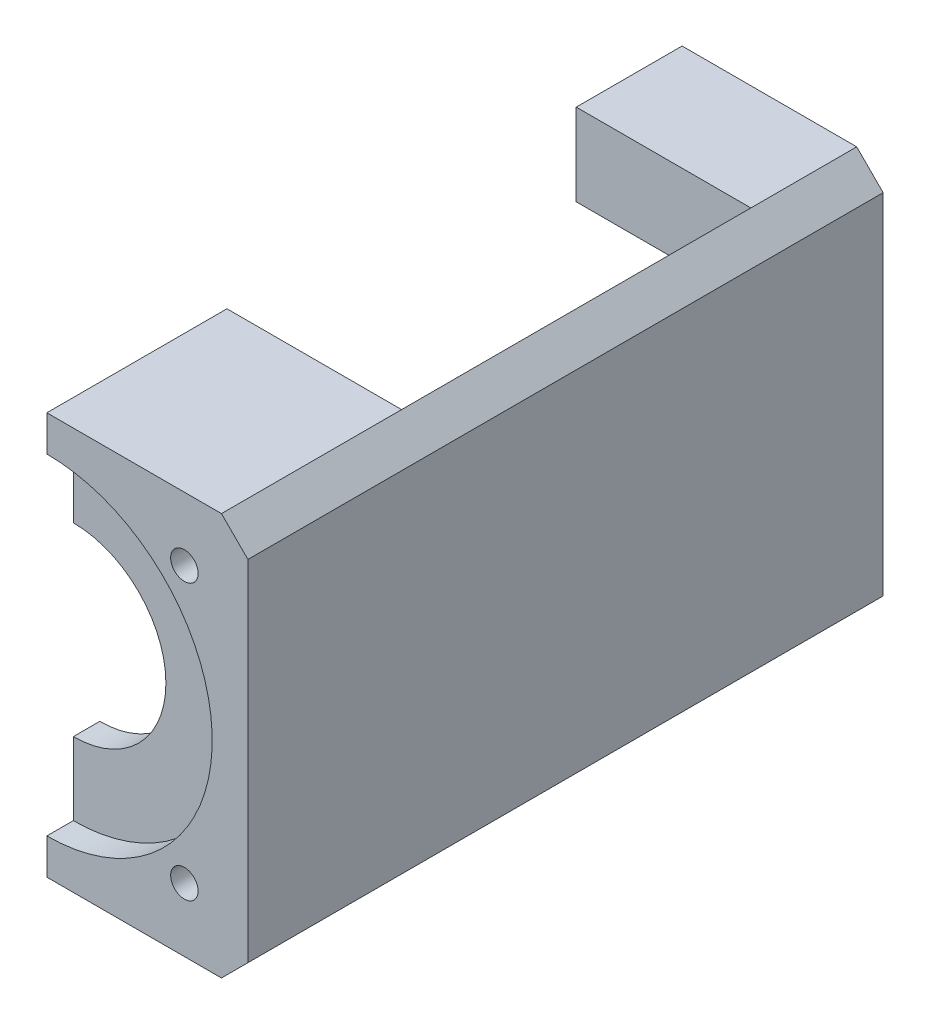
ISO-10303-21;
HEADER;
FILE_DESCRIPTION(('STEP AP214'),'2;1');
FILE_NAME('part.step','',(''),(''),'','','');
FILE_SCHEMA(('AUTOMOTIVE_DESIGN { 1 0 10303 214 1 1 1 1 }'));
ENDSEC;
DATA;
#1=APPLICATION_CONTEXT('core data for automotive mechanical design processes');
#2=APPLICATION_PROTOCOL_DEFINITION('international standard','automotive_design',2000,#1);
#3=PRODUCT_CONTEXT('',#1,'mechanical');
#4=PRODUCT('Part','Part','',(#3));
#5=PRODUCT_RELATED_PRODUCT_CATEGORY('part','',(#4));
#6=PRODUCT_DEFINITION_FORMATION('','',#4);
#7=PRODUCT_DEFINITION_CONTEXT('part definition',#1,'design');
#8=PRODUCT_DEFINITION('design','',#6,#7);
#9=PRODUCT_DEFINITION_SHAPE('','',#8);
#10=(LENGTH_UNIT() NAMED_UNIT(*) SI_UNIT(.MILLI.,.METRE.));
#11=(NAMED_UNIT(*) PLANE_ANGLE_UNIT() SI_UNIT($,.RADIAN.));
#12=(NAMED_UNIT(*) SI_UNIT($,.STERADIAN.) SOLID_ANGLE_UNIT());
#13=UNCERTAINTY_MEASURE_WITH_UNIT(LENGTH_MEASURE(1.E-05),#10,'distance_accuracy_value','');
#14=(GEOMETRIC_REPRESENTATION_CONTEXT(3) GLOBAL_UNCERTAINTY_ASSIGNED_CONTEXT((#13)) GLOBAL_UNIT_ASSIGNED_CONTEXT((#10,
#11,#12)) REPRESENTATION_CONTEXT('',''));
#15=CARTESIAN_POINT('',(0.,0.,0.));
#16=DIRECTION('',(0.,0.,1.));
#17=DIRECTION('',(1.,0.,0.));
#18=AXIS2_PLACEMENT_3D('',#15,#16,#17);
#19=CARTESIAN_POINT('',(20.955,0.,0.));
#20=DIRECTION('',(1.,0.,0.));
#21=DIRECTION('',(0.,1.,0.));
#22=AXIS2_PLACEMENT_3D('',#19,#20,#21);
#23=PLANE('',#22);
#24=DIRECTION('',(0.,1.,0.));
#25=VECTOR('',#24,1.);
#26=CARTESIAN_POINT('',(20.955,-3.175,-69.8754));
#27=LINE('',#26,#25);
#28=CARTESIAN_POINT('',(20.955,36.83,-69.8754));
#29=VERTEX_POINT('',#28);
#30=CARTESIAN_POINT('',(20.955,45.085,-69.8754));
#31=VERTEX_POINT('',#30);
#32=EDGE_CURVE('E291',#29,#31,#27,.T.);
#33=ORIENTED_EDGE('',*,*,#32,.F.);
#34=DIRECTION('',(0.,-0.707106781186544,0.707106781186551));
#35=VECTOR('',#34,1.);
#36=CARTESIAN_POINT('',(20.955,35.2425,-68.2879));
#37=LINE('',#36,#35);
#38=CARTESIAN_POINT('',(20.955,35.2425,-68.2879));
#39=VERTEX_POINT('',#38);
#40=EDGE_CURVE('E361',#29,#39,#37,.T.);
#41=ORIENTED_EDGE('',*,*,#40,.T.);
#42=DIRECTION('',(0.,0.,1.));
#43=VECTOR('',#42,1.);
#44=CARTESIAN_POINT('',(20.955,35.2425,0.));
#45=LINE('',#44,#43);
#46=CARTESIAN_POINT('',(20.955,35.2425,-57.1754));
#47=VERTEX_POINT('',#46);
#48=EDGE_CURVE('E299',#39,#47,#45,.T.);
#49=ORIENTED_EDGE('',*,*,#48,.T.);
#50=DIRECTION('',(0.,1.,0.));
#51=VECTOR('',#50,1.);
#52=CARTESIAN_POINT('',(20.955,45.085,-57.1754));
#53=LINE('',#52,#51);
#54=CARTESIAN_POINT('',(20.955,45.085,-57.1754));
#55=VERTEX_POINT('',#54);
#56=EDGE_CURVE('E344',#47,#55,#53,.T.);
#57=ORIENTED_EDGE('',*,*,#56,.T.);
#58=DIRECTION('',(0.,0.,-1.));
#59=VECTOR('',#58,1.);
#60=CARTESIAN_POINT('',(20.955,45.085,6.35));
#61=LINE('',#60,#59);
#62=EDGE_CURVE('E466',#55,#31,#61,.T.);
#63=ORIENTED_EDGE('',*,*,#62,.T.);
#64=EDGE_LOOP('',(#33,#41,#49,#57,#63));
#65=FACE_BOUND('',#64,.T.);
#66=ADVANCED_FACE('F40',(#65),#23,.F.);
#67=CARTESIAN_POINT('',(-3.175,45.085,-68.2499465201256));
#68=DIRECTION('',(0.,1.,0.));
#69=DIRECTION('',(0.,0.,1.));
#70=AXIS2_PLACEMENT_3D('',#67,#68,#69);
#71=PLANE('',#70);
#72=DIRECTION('',(-1.,0.,0.));
#73=VECTOR('',#72,1.);
#74=CARTESIAN_POINT('',(-3.175,45.085,6.35));
#75=LINE('',#74,#73);
#76=CARTESIAN_POINT('',(41.91,45.085,6.35));
#77=VERTEX_POINT('',#76);
#78=CARTESIAN_POINT('',(20.955,45.085,6.35));
#79=VERTEX_POINT('',#78);
#80=EDGE_CURVE('E411',#77,#79,#75,.T.);
#81=ORIENTED_EDGE('',*,*,#80,.F.);
#82=DIRECTION('',(0.,0.,-1.));
#83=VECTOR('',#82,1.);
#84=CARTESIAN_POINT('',(41.91,45.085,-68.2499465201256));
#85=LINE('',#84,#83);
#86=CARTESIAN_POINT('',(41.91,45.085,-15.2654));
#87=VERTEX_POINT('',#86);
#88=EDGE_CURVE('E232',#77,#87,#85,.T.);
#89=ORIENTED_EDGE('',*,*,#88,.T.);
#90=DIRECTION('',(1.,0.,0.));
#91=VECTOR('',#90,1.);
#92=CARTESIAN_POINT('',(0.,45.085,-15.2654));
#93=LINE('',#92,#91);
#94=CARTESIAN_POINT('',(20.955,45.085,-15.2654));
#95=VERTEX_POINT('',#94);
#96=EDGE_CURVE('E332',#95,#87,#93,.T.);
#97=ORIENTED_EDGE('',*,*,#96,.F.);
#98=EDGE_CURVE('E461',#79,#95,#61,.T.);
#99=ORIENTED_EDGE('',*,*,#98,.F.);
#100=EDGE_LOOP('',(#81,#89,#97,#99));
#101=FACE_BOUND('',#100,.T.);
#102=ADVANCED_FACE('F464',(#101),#71,.T.);
#103=DIRECTION('',(-1.,0.,0.));
#104=VECTOR('',#103,1.);
#105=CARTESIAN_POINT('',(0.,45.085,-57.1754));
#106=LINE('',#105,#104);
#107=CARTESIAN_POINT('',(41.91,45.085,-57.1754));
#108=VERTEX_POINT('',#107);
#109=EDGE_CURVE('E281',#108,#55,#106,.T.);
#110=ORIENTED_EDGE('',*,*,#109,.F.);
#111=DIRECTION('',(0.,0.,-1.));
#112=VECTOR('',#111,1.);
#113=CARTESIAN_POINT('',(41.91,45.085,-68.2499465201256));
#114=LINE('',#113,#112);
#115=CARTESIAN_POINT('',(41.91,45.085,-69.8754));
#116=VERTEX_POINT('',#115);
#117=EDGE_CURVE('E233',#108,#116,#114,.T.);
#118=ORIENTED_EDGE('',*,*,#117,.T.);
#119=DIRECTION('',(1.,0.,0.));
#120=VECTOR('',#119,1.);
#121=CARTESIAN_POINT('',(20.955,45.085,-69.8754));
#122=LINE('',#121,#120);
#123=EDGE_CURVE('E279',#31,#116,#122,.T.);
#124=ORIENTED_EDGE('',*,*,#123,.F.);
#125=ORIENTED_EDGE('',*,*,#62,.F.);
#126=EDGE_LOOP('',(#110,#118,#124,#125));
#127=FACE_BOUND('',#126,.T.);
#128=ADVANCED_FACE('F277',(#127),#71,.T.);
#129=DIRECTION('',(0.,0.,1.));
#130=VECTOR('',#129,1.);
#131=CARTESIAN_POINT('',(20.955,41.91,-57.1754));
#132=LINE('',#131,#130);
#133=CARTESIAN_POINT('',(20.955,41.91,-15.2654));
#134=VERTEX_POINT('',#133);
#135=CARTESIAN_POINT('',(20.955,41.91,-1.5875));
#136=VERTEX_POINT('',#135);
#137=EDGE_CURVE('E244',#134,#136,#132,.T.);
#138=ORIENTED_EDGE('',*,*,#137,.T.);
#139=CARTESIAN_POINT('',(20.955,41.91,0.));
#140=DIRECTION('',(-1.,0.,0.));
#141=DIRECTION('',(0.,-1.,0.));
#142=AXIS2_PLACEMENT_3D('',#139,#140,#141);
#143=CIRCLE('',#142,1.5875);
#144=CARTESIAN_POINT('',(20.955,40.3225,0.));
#145=VERTEX_POINT('',#144);
#146=EDGE_CURVE('E322',#145,#136,#143,.T.);
#147=ORIENTED_EDGE('',*,*,#146,.F.);
#148=DIRECTION('',(0.,-1.,0.));
#149=VECTOR('',#148,1.);
#150=CARTESIAN_POINT('',(20.955,45.085,0.));
#151=LINE('',#150,#149);
#152=CARTESIAN_POINT('',(20.955,32.0675,0.));
#153=VERTEX_POINT('',#152);
#154=EDGE_CURVE('E237',#145,#153,#151,.T.);
#155=ORIENTED_EDGE('',*,*,#154,.T.);
#156=DIRECTION('',(0.,0.,-1.));
#157=VECTOR('',#156,1.);
#158=CARTESIAN_POINT('',(20.955,32.0675,6.35));
#159=LINE('',#158,#157);
#160=CARTESIAN_POINT('',(20.955,32.0675,3.175));
#161=VERTEX_POINT('',#160);
#162=EDGE_CURVE('E404',#153,#161,#159,.F.);
#163=ORIENTED_EDGE('',*,*,#162,.T.);
#164=DIRECTION('',(0.,1.,0.));
#165=VECTOR('',#164,1.);
#166=CARTESIAN_POINT('',(20.955,20.955,3.175));
#167=LINE('',#166,#165);
#168=CARTESIAN_POINT('',(20.955,40.79875,3.175));
#169=VERTEX_POINT('',#168);
#170=EDGE_CURVE('E397',#161,#169,#167,.T.);
#171=ORIENTED_EDGE('',*,*,#170,.T.);
#172=DIRECTION('',(0.,0.,1.));
#173=VECTOR('',#172,1.);
#174=CARTESIAN_POINT('',(20.955,40.79875,3.175));
#175=LINE('',#174,#173);
#176=CARTESIAN_POINT('',(20.955,40.79875,6.35));
#177=VERTEX_POINT('',#176);
#178=EDGE_CURVE('E400',#177,#169,#175,.F.);
#179=ORIENTED_EDGE('',*,*,#178,.F.);
#180=DIRECTION('',(0.,1.,0.));
#181=VECTOR('',#180,1.);
#182=CARTESIAN_POINT('',(20.955,-3.175,6.35));
#183=LINE('',#182,#181);
#184=EDGE_CURVE('E389',#177,#79,#183,.T.);
#185=ORIENTED_EDGE('',*,*,#184,.T.);
#186=ORIENTED_EDGE('',*,*,#98,.T.);
#187=DIRECTION('',(0.,-1.,0.));
#188=VECTOR('',#187,1.);
#189=CARTESIAN_POINT('',(20.955,45.085,-15.2654));
#190=LINE('',#189,#188);
#191=EDGE_CURVE('E341',#95,#134,#190,.T.);
#192=ORIENTED_EDGE('',*,*,#191,.T.);
#193=EDGE_LOOP('',(#138,#147,#155,#163,#171,#179,#185,#186,#192));
#194=FACE_BOUND('',#193,.T.);
#195=ADVANCED_FACE('F450',(#194),#23,.F.);
#196=DIRECTION('',(0.,0.,-1.));
#197=VECTOR('',#196,1.);
#198=CARTESIAN_POINT('',(20.955,6.6675,0.));
#199=LINE('',#198,#197);
#200=CARTESIAN_POINT('',(20.955,6.6675,-57.1754));
#201=VERTEX_POINT('',#200);
#202=CARTESIAN_POINT('',(20.955,6.6675,-68.2879));
#203=VERTEX_POINT('',#202);
#204=EDGE_CURVE('E215',#201,#203,#199,.T.);
#205=ORIENTED_EDGE('',*,*,#204,.T.);
#206=DIRECTION('',(0.,-0.707106781186544,-0.707106781186551));
#207=VECTOR('',#206,1.);
#208=CARTESIAN_POINT('',(20.955,6.6675,-68.2879));
#209=LINE('',#208,#207);
#210=CARTESIAN_POINT('',(20.955,5.08000000000002,-69.8754));
#211=VERTEX_POINT('',#210);
#212=EDGE_CURVE('E11',#203,#211,#209,.T.);
#213=ORIENTED_EDGE('',*,*,#212,.T.);
#214=CARTESIAN_POINT('',(20.955,-3.175,-69.8754));
#215=VERTEX_POINT('',#214);
#216=EDGE_CURVE('E294',#215,#211,#27,.T.);
#217=ORIENTED_EDGE('',*,*,#216,.F.);
#218=DIRECTION('',(0.,0.,1.));
#219=VECTOR('',#218,1.);
#220=CARTESIAN_POINT('',(20.955,-3.175,0.));
#221=LINE('',#220,#219);
#222=CARTESIAN_POINT('',(20.955,-3.175,6.35));
#223=VERTEX_POINT('',#222);
#224=EDGE_CURVE('E386',#215,#223,#221,.T.);
#225=ORIENTED_EDGE('',*,*,#224,.T.);
#226=CARTESIAN_POINT('',(20.955,1.11125,6.35));
#227=VERTEX_POINT('',#226);
#228=EDGE_CURVE('E392',#223,#227,#183,.T.);
#229=ORIENTED_EDGE('',*,*,#228,.T.);
#230=DIRECTION('',(0.,0.,1.));
#231=VECTOR('',#230,1.);
#232=CARTESIAN_POINT('',(20.955,1.11125,3.175));
#233=LINE('',#232,#231);
#234=CARTESIAN_POINT('',(20.955,1.11125,3.175));
#235=VERTEX_POINT('',#234);
#236=EDGE_CURVE('E406',#235,#227,#233,.T.);
#237=ORIENTED_EDGE('',*,*,#236,.F.);
#238=CARTESIAN_POINT('',(20.955,9.8425,3.175));
#239=VERTEX_POINT('',#238);
#240=EDGE_CURVE('E401',#235,#239,#167,.T.);
#241=ORIENTED_EDGE('',*,*,#240,.T.);
#242=DIRECTION('',(0.,0.,-1.));
#243=VECTOR('',#242,1.);
#244=CARTESIAN_POINT('',(20.955,9.8425,6.35));
#245=LINE('',#244,#243);
#246=CARTESIAN_POINT('',(20.955,9.8425,0.));
#247=VERTEX_POINT('',#246);
#248=EDGE_CURVE('E409',#239,#247,#245,.T.);
#249=ORIENTED_EDGE('',*,*,#248,.T.);
#250=CARTESIAN_POINT('',(20.955,1.5875,0.));
#251=VERTEX_POINT('',#250);
#252=EDGE_CURVE('E250',#247,#251,#151,.T.);
#253=ORIENTED_EDGE('',*,*,#252,.T.);
#254=CARTESIAN_POINT('',(20.955,0.,0.));
#255=DIRECTION('',(-1.,0.,0.));
#256=DIRECTION('',(0.,-1.,0.));
#257=AXIS2_PLACEMENT_3D('',#254,#255,#256);
#258=CIRCLE('',#257,1.5875);
#259=CARTESIAN_POINT('',(20.955,0.,-1.5875));
#260=VERTEX_POINT('',#259);
#261=EDGE_CURVE('E293',#260,#251,#258,.T.);
#262=ORIENTED_EDGE('',*,*,#261,.F.);
#263=DIRECTION('',(0.,0.,1.));
#264=VECTOR('',#263,1.);
#265=CARTESIAN_POINT('',(20.955,0.,-57.1754));
#266=LINE('',#265,#264);
#267=CARTESIAN_POINT('',(20.955,0.,-50.5079));
#268=VERTEX_POINT('',#267);
#269=EDGE_CURVE('E241',#268,#260,#266,.T.);
#270=ORIENTED_EDGE('',*,*,#269,.F.);
#271=CARTESIAN_POINT('',(20.955,6.6675,-50.5079));
#272=DIRECTION('',(1.,0.,0.));
#273=DIRECTION('',(0.,1.,0.));
#274=AXIS2_PLACEMENT_3D('',#271,#272,#273);
#275=CIRCLE('',#274,6.6675);
#276=EDGE_CURVE('E351',#268,#201,#275,.T.);
#277=ORIENTED_EDGE('',*,*,#276,.T.);
#278=EDGE_LOOP('',(#205,#213,#217,#225,#229,#237,#241,#249,#253,#262,#270,#277));
#279=FACE_BOUND('',#278,.T.);
#280=ADVANCED_FACE('F379',(#279),#23,.F.);
#281=CARTESIAN_POINT('',(0.,41.91,-57.1754));
#282=DIRECTION('',(0.,1.,0.));
#283=DIRECTION('',(0.,0.,1.));
#284=AXIS2_PLACEMENT_3D('',#281,#282,#283);
#285=PLANE('',#284);
#286=DIRECTION('',(0.,0.,1.));
#287=VECTOR('',#286,1.);
#288=CARTESIAN_POINT('',(41.91,41.91,-57.1754));
#289=LINE('',#288,#287);
#290=CARTESIAN_POINT('',(41.91,41.91,-15.2654));
#291=VERTEX_POINT('',#290);
#292=CARTESIAN_POINT('',(41.91,41.91,-1.5875));
#293=VERTEX_POINT('',#292);
#294=EDGE_CURVE('E256',#291,#293,#289,.T.);
#295=ORIENTED_EDGE('',*,*,#294,.T.);
#296=DIRECTION('',(-1.,0.,0.));
#297=VECTOR('',#296,1.);
#298=CARTESIAN_POINT('',(46.4001280605346,41.91,-1.5875));
#299=LINE('',#298,#297);
#300=EDGE_CURVE('E329',#293,#136,#299,.T.);
#301=ORIENTED_EDGE('',*,*,#300,.T.);
#302=ORIENTED_EDGE('',*,*,#137,.F.);
#303=DIRECTION('',(-1.,0.,0.));
#304=VECTOR('',#303,1.);
#305=CARTESIAN_POINT('',(0.,41.91,-15.2654));
#306=LINE('',#305,#304);
#307=EDGE_CURVE('E257',#291,#134,#306,.T.);
#308=ORIENTED_EDGE('',*,*,#307,.F.);
#309=EDGE_LOOP('',(#295,#301,#302,#308));
#310=FACE_BOUND('',#309,.T.);
#311=ADVANCED_FACE('F484',(#310),#285,.F.);
#312=CARTESIAN_POINT('',(20.955,20.955,6.35));
#313=DIRECTION('',(0.,0.,-1.));
#314=DIRECTION('',(-1.,0.,0.));
#315=AXIS2_PLACEMENT_3D('',#312,#313,#314);
#316=CYLINDRICAL_SURFACE('',#315,11.1125);
#317=ORIENTED_EDGE('',*,*,#248,.F.);
#318=CARTESIAN_POINT('',(20.955,20.955,3.175));
#319=DIRECTION('',(0.,0.,1.));
#320=DIRECTION('',(1.,0.,0.));
#321=AXIS2_PLACEMENT_3D('',#318,#319,#320);
#322=CIRCLE('',#321,11.1125);
#323=EDGE_CURVE('E421',#239,#161,#322,.T.);
#324=ORIENTED_EDGE('',*,*,#323,.T.);
#325=ORIENTED_EDGE('',*,*,#162,.F.);
#326=CARTESIAN_POINT('',(20.955,20.955,0.));
#327=DIRECTION('',(0.,0.,1.));
#328=DIRECTION('',(1.,0.,0.));
#329=AXIS2_PLACEMENT_3D('',#326,#327,#328);
#330=CIRCLE('',#329,11.1125);
#331=EDGE_CURVE('E427',#247,#153,#330,.T.);
#332=ORIENTED_EDGE('',*,*,#331,.F.);
#333=EDGE_LOOP('',(#317,#324,#325,#332));
#334=FACE_BOUND('',#333,.T.);
#335=ADVANCED_FACE('F442',(#334),#316,.F.);
#336=CARTESIAN_POINT('',(0.,0.,6.35));
#337=DIRECTION('',(0.,0.,-1.));
#338=DIRECTION('',(-1.,0.,0.));
#339=AXIS2_PLACEMENT_3D('',#336,#337,#338);
#340=PLANE('',#339);
#341=DIRECTION('',(1.,0.,0.));
#342=VECTOR('',#341,1.);
#343=CARTESIAN_POINT('',(-3.17499999999999,-3.175,6.35));
#344=LINE('',#343,#342);
#345=CARTESIAN_POINT('',(41.91,-3.175,6.35));
#346=VERTEX_POINT('',#345);
#347=EDGE_CURVE('E387',#223,#346,#344,.T.);
#348=ORIENTED_EDGE('',*,*,#347,.T.);
#349=DIRECTION('',(-0.707106781186545,-0.70710678118655,0.));
#350=VECTOR('',#349,1.);
#351=CARTESIAN_POINT('',(41.91,-3.175,6.34999999999999));
#352=LINE('',#351,#350);
#353=CARTESIAN_POINT('',(45.085,0.,6.35));
#354=VERTEX_POINT('',#353);
#355=EDGE_CURVE('E265',#346,#354,#352,.F.);
#356=ORIENTED_EDGE('',*,*,#355,.T.);
#357=DIRECTION('',(0.,1.,0.));
#358=VECTOR('',#357,1.);
#359=CARTESIAN_POINT('',(45.085,45.085,6.35));
#360=LINE('',#359,#358);
#361=CARTESIAN_POINT('',(45.085,41.91,6.35));
#362=VERTEX_POINT('',#361);
#363=EDGE_CURVE('E414',#354,#362,#360,.T.);
#364=ORIENTED_EDGE('',*,*,#363,.T.);
#365=DIRECTION('',(0.707106781186551,-0.707106781186544,0.));
#366=VECTOR('',#365,1.);
#367=CARTESIAN_POINT('',(45.085,41.91,6.34999999999999));
#368=LINE('',#367,#366);
#369=EDGE_CURVE('E263',#362,#77,#368,.F.);
#370=ORIENTED_EDGE('',*,*,#369,.T.);
#371=ORIENTED_EDGE('',*,*,#80,.T.);
#372=ORIENTED_EDGE('',*,*,#184,.F.);
#373=CARTESIAN_POINT('',(20.955,20.955,6.35));
#374=DIRECTION('',(0.,0.,1.));
#375=DIRECTION('',(1.,0.,0.));
#376=AXIS2_PLACEMENT_3D('',#373,#374,#375);
#377=CIRCLE('',#376,19.84375);
#378=EDGE_CURVE('E413',#227,#177,#377,.T.);
#379=ORIENTED_EDGE('',*,*,#378,.F.);
#380=ORIENTED_EDGE('',*,*,#228,.F.);
#381=EDGE_LOOP('',(#348,#356,#364,#370,#371,#372,#379,#380));
#382=FACE_BOUND('',#381,.T.);
#383=CARTESIAN_POINT('',(37.4607107505251,37.4607107505251,6.35));
#384=DIRECTION('',(0.,0.,1.));
#385=DIRECTION('',(1.,0.,0.));
#386=AXIS2_PLACEMENT_3D('',#383,#384,#385);
#387=CIRCLE('',#386,1.64973);
#388=CARTESIAN_POINT('',(39.1104407505251,37.4607107505251,6.35));
#389=VERTEX_POINT('',#388);
#390=EDGE_CURVE('E260',#389,#389,#387,.T.);
#391=ORIENTED_EDGE('',*,*,#390,.F.);
#392=EDGE_LOOP('',(#391));
#393=FACE_BOUND('',#392,.T.);
#394=CARTESIAN_POINT('',(37.4607107505255,4.44928924947537,6.35));
#395=DIRECTION('',(0.,0.,1.));
#396=DIRECTION('',(1.,0.,0.));
#397=AXIS2_PLACEMENT_3D('',#394,#395,#396);
#398=CIRCLE('',#397,1.64973);
#399=CARTESIAN_POINT('',(39.1104407505255,4.44928924947537,6.35));
#400=VERTEX_POINT('',#399);
#401=EDGE_CURVE('E424',#400,#400,#398,.T.);
#402=ORIENTED_EDGE('',*,*,#401,.F.);
#403=EDGE_LOOP('',(#402));
#404=FACE_BOUND('',#403,.T.);
#405=ADVANCED_FACE('F456',(#382,#393,#404),#340,.F.);
#406=CARTESIAN_POINT('',(0.,0.,0.));
#407=DIRECTION('',(0.,0.,-1.));
#408=DIRECTION('',(-1.,0.,0.));
#409=AXIS2_PLACEMENT_3D('',#406,#407,#408);
#410=PLANE('',#409);
#411=DIRECTION('',(-1.,0.,0.));
#412=VECTOR('',#411,1.);
#413=CARTESIAN_POINT('',(46.4001280605346,1.5875,0.));
#414=LINE('',#413,#412);
#415=CARTESIAN_POINT('',(41.91,1.5875,0.));
#416=VERTEX_POINT('',#415);
#417=EDGE_CURVE('E320',#251,#416,#414,.F.);
#418=ORIENTED_EDGE('',*,*,#417,.F.);
#419=ORIENTED_EDGE('',*,*,#252,.F.);
#420=ORIENTED_EDGE('',*,*,#331,.T.);
#421=ORIENTED_EDGE('',*,*,#154,.F.);
#422=DIRECTION('',(-1.,0.,0.));
#423=VECTOR('',#422,1.);
#424=CARTESIAN_POINT('',(46.4001280605346,40.3225,0.));
#425=LINE('',#424,#423);
#426=CARTESIAN_POINT('',(41.91,40.3225,0.));
#427=VERTEX_POINT('',#426);
#428=EDGE_CURVE('E327',#427,#145,#425,.T.);
#429=ORIENTED_EDGE('',*,*,#428,.F.);
#430=DIRECTION('',(0.,1.,0.));
#431=VECTOR('',#430,1.);
#432=CARTESIAN_POINT('',(41.91,0.,0.));
#433=LINE('',#432,#431);
#434=EDGE_CURVE('E350',#416,#427,#433,.T.);
#435=ORIENTED_EDGE('',*,*,#434,.F.);
#436=EDGE_LOOP('',(#418,#419,#420,#421,#429,#435));
#437=FACE_BOUND('',#436,.T.);
#438=CARTESIAN_POINT('',(37.4607107505251,37.4607107505251,0.));
#439=DIRECTION('',(0.,0.,1.));
#440=DIRECTION('',(1.,0.,0.));
#441=AXIS2_PLACEMENT_3D('',#438,#439,#440);
#442=CIRCLE('',#441,1.64973);
#443=CARTESIAN_POINT('',(39.1104407505251,37.4607107505251,0.));
#444=VERTEX_POINT('',#443);
#445=EDGE_CURVE('E433',#444,#444,#442,.T.);
#446=ORIENTED_EDGE('',*,*,#445,.T.);
#447=EDGE_LOOP('',(#446));
#448=FACE_BOUND('',#447,.T.);
#449=CARTESIAN_POINT('',(37.4607107505255,4.44928924947537,0.));
#450=DIRECTION('',(0.,0.,1.));
#451=DIRECTION('',(1.,0.,0.));
#452=AXIS2_PLACEMENT_3D('',#449,#450,#451);
#453=CIRCLE('',#452,1.64973);
#454=CARTESIAN_POINT('',(39.1104407505255,4.44928924947537,0.));
#455=VERTEX_POINT('',#454);
#456=EDGE_CURVE('E428',#455,#455,#453,.T.);
#457=ORIENTED_EDGE('',*,*,#456,.T.);
#458=EDGE_LOOP('',(#457));
#459=FACE_BOUND('',#458,.T.);
#460=ADVANCED_FACE('F491',(#437,#448,#459),#410,.T.);
#461=CARTESIAN_POINT('',(37.4607107505251,37.4607107505251,6.35));
#462=DIRECTION('',(0.,0.,-1.));
#463=DIRECTION('',(-1.,0.,0.));
#464=AXIS2_PLACEMENT_3D('',#461,#462,#463);
#465=CYLINDRICAL_SURFACE('',#464,1.64973);
#466=ORIENTED_EDGE('',*,*,#390,.T.);
#467=EDGE_LOOP('',(#466));
#468=FACE_BOUND('',#467,.T.);
#469=ORIENTED_EDGE('',*,*,#445,.F.);
#470=EDGE_LOOP('',(#469));
#471=FACE_BOUND('',#470,.T.);
#472=ADVANCED_FACE('F535',(#468,#471),#465,.F.);
#473=CARTESIAN_POINT('',(37.4607107505255,4.44928924947537,6.35));
#474=DIRECTION('',(0.,0.,-1.));
#475=DIRECTION('',(-1.,0.,0.));
#476=AXIS2_PLACEMENT_3D('',#473,#474,#475);
#477=CYLINDRICAL_SURFACE('',#476,1.64973);
#478=ORIENTED_EDGE('',*,*,#401,.T.);
#479=EDGE_LOOP('',(#478));
#480=FACE_BOUND('',#479,.T.);
#481=ORIENTED_EDGE('',*,*,#456,.F.);
#482=EDGE_LOOP('',(#481));
#483=FACE_BOUND('',#482,.T.);
#484=ADVANCED_FACE('F532',(#480,#483),#477,.F.);
#485=CARTESIAN_POINT('',(20.955,20.955,3.175));
#486=DIRECTION('',(0.,0.,1.));
#487=DIRECTION('',(1.,0.,0.));
#488=AXIS2_PLACEMENT_3D('',#485,#486,#487);
#489=CYLINDRICAL_SURFACE('',#488,19.84375);
#490=ORIENTED_EDGE('',*,*,#378,.T.);
#491=ORIENTED_EDGE('',*,*,#178,.T.);
#492=CARTESIAN_POINT('',(20.955,20.955,3.175));
#493=DIRECTION('',(0.,0.,1.));
#494=DIRECTION('',(1.,0.,0.));
#495=AXIS2_PLACEMENT_3D('',#492,#493,#494);
#496=CIRCLE('',#495,19.84375);
#497=EDGE_CURVE('E418',#235,#169,#496,.T.);
#498=ORIENTED_EDGE('',*,*,#497,.F.);
#499=ORIENTED_EDGE('',*,*,#236,.T.);
#500=EDGE_LOOP('',(#490,#491,#498,#499));
#501=FACE_BOUND('',#500,.T.);
#502=ADVANCED_FACE('F453',(#501),#489,.F.);
#503=CARTESIAN_POINT('',(20.955,20.955,3.175));
#504=DIRECTION('',(0.,0.,1.));
#505=DIRECTION('',(1.,0.,0.));
#506=AXIS2_PLACEMENT_3D('',#503,#504,#505);
#507=PLANE('',#506);
#508=ORIENTED_EDGE('',*,*,#240,.F.);
#509=ORIENTED_EDGE('',*,*,#497,.T.);
#510=ORIENTED_EDGE('',*,*,#170,.F.);
#511=ORIENTED_EDGE('',*,*,#323,.F.);
#512=EDGE_LOOP('',(#508,#509,#510,#511));
#513=FACE_BOUND('',#512,.T.);
#514=ADVANCED_FACE('F447',(#513),#507,.T.);
#515=CARTESIAN_POINT('',(45.085,45.085,-68.2499465201256));
#516=DIRECTION('',(1.,0.,0.));
#517=DIRECTION('',(0.,0.,-1.));
#518=AXIS2_PLACEMENT_3D('',#515,#516,#517);
#519=PLANE('',#518);
#520=ORIENTED_EDGE('',*,*,#363,.F.);
#521=DIRECTION('',(0.,0.,-1.));
#522=VECTOR('',#521,1.);
#523=CARTESIAN_POINT('',(45.085,0.,-68.2499465201256));
#524=LINE('',#523,#522);
#525=CARTESIAN_POINT('',(45.085,0.,-69.8754));
#526=VERTEX_POINT('',#525);
#527=EDGE_CURVE('E270',#354,#526,#524,.T.);
#528=ORIENTED_EDGE('',*,*,#527,.T.);
#529=DIRECTION('',(0.,-1.,0.));
#530=VECTOR('',#529,1.);
#531=CARTESIAN_POINT('',(45.085,41.91,-69.8754));
#532=LINE('',#531,#530);
#533=CARTESIAN_POINT('',(45.085,41.91,-69.8754));
#534=VERTEX_POINT('',#533);
#535=EDGE_CURVE('E298',#534,#526,#532,.T.);
#536=ORIENTED_EDGE('',*,*,#535,.F.);
#537=DIRECTION('',(0.,0.,1.));
#538=VECTOR('',#537,1.);
#539=CARTESIAN_POINT('',(45.085,41.91,-68.2499465201256));
#540=LINE('',#539,#538);
#541=EDGE_CURVE('E267',#534,#362,#540,.T.);
#542=ORIENTED_EDGE('',*,*,#541,.T.);
#543=EDGE_LOOP('',(#520,#528,#536,#542));
#544=FACE_BOUND('',#543,.T.);
#545=ADVANCED_FACE('F510',(#544),#519,.T.);
#546=CARTESIAN_POINT('',(-3.17499999999999,-3.175,-68.2499465201256));
#547=DIRECTION('',(0.,-1.,0.));
#548=DIRECTION('',(0.,0.,-1.));
#549=AXIS2_PLACEMENT_3D('',#546,#547,#548);
#550=PLANE('',#549);
#551=ORIENTED_EDGE('',*,*,#224,.F.);
#552=DIRECTION('',(-1.,0.,0.));
#553=VECTOR('',#552,1.);
#554=CARTESIAN_POINT('',(41.91,-3.175,-69.8754));
#555=LINE('',#554,#553);
#556=CARTESIAN_POINT('',(41.91,-3.175,-69.8754));
#557=VERTEX_POINT('',#556);
#558=EDGE_CURVE('E308',#557,#215,#555,.T.);
#559=ORIENTED_EDGE('',*,*,#558,.F.);
#560=DIRECTION('',(0.,0.,1.));
#561=VECTOR('',#560,1.);
#562=CARTESIAN_POINT('',(41.91,-3.175,-68.2499465201256));
#563=LINE('',#562,#561);
#564=EDGE_CURVE('E259',#557,#346,#563,.T.);
#565=ORIENTED_EDGE('',*,*,#564,.T.);
#566=ORIENTED_EDGE('',*,*,#347,.F.);
#567=EDGE_LOOP('',(#551,#559,#565,#566));
#568=FACE_BOUND('',#567,.T.);
#569=ADVANCED_FACE('F383',(#568),#550,.T.);
#570=CARTESIAN_POINT('',(0.,0.,-57.1754));
#571=DIRECTION('',(0.,-1.,0.));
#572=DIRECTION('',(1.,0.,0.));
#573=AXIS2_PLACEMENT_3D('',#570,#571,#572);
#574=PLANE('',#573);
#575=DIRECTION('',(0.,0.,1.));
#576=VECTOR('',#575,1.);
#577=CARTESIAN_POINT('',(41.91,0.,-57.1754));
#578=LINE('',#577,#576);
#579=CARTESIAN_POINT('',(41.91,0.,-50.5079));
#580=VERTEX_POINT('',#579);
#581=CARTESIAN_POINT('',(41.91,0.,-1.5875));
#582=VERTEX_POINT('',#581);
#583=EDGE_CURVE('E468',#580,#582,#578,.T.);
#584=ORIENTED_EDGE('',*,*,#583,.F.);
#585=DIRECTION('',(1.,0.,0.));
#586=VECTOR('',#585,1.);
#587=CARTESIAN_POINT('',(20.955,0.,-50.5079));
#588=LINE('',#587,#586);
#589=EDGE_CURVE('E240',#580,#268,#588,.F.);
#590=ORIENTED_EDGE('',*,*,#589,.T.);
#591=ORIENTED_EDGE('',*,*,#269,.T.);
#592=DIRECTION('',(-1.,0.,0.));
#593=VECTOR('',#592,1.);
#594=CARTESIAN_POINT('',(46.4001280605346,0.,-1.5875));
#595=LINE('',#594,#593);
#596=EDGE_CURVE('E317',#260,#582,#595,.F.);
#597=ORIENTED_EDGE('',*,*,#596,.T.);
#598=EDGE_LOOP('',(#584,#590,#591,#597));
#599=FACE_BOUND('',#598,.T.);
#600=ADVANCED_FACE('F502',(#599),#574,.F.);
#601=CARTESIAN_POINT('',(41.91,0.,-57.1754));
#602=DIRECTION('',(1.,0.,0.));
#603=DIRECTION('',(0.,0.,-1.));
#604=AXIS2_PLACEMENT_3D('',#601,#602,#603);
#605=PLANE('',#604);
#606=DIRECTION('',(0.,1.,0.));
#607=VECTOR('',#606,1.);
#608=CARTESIAN_POINT('',(41.91,0.,-57.1754));
#609=LINE('',#608,#607);
#610=CARTESIAN_POINT('',(41.91,6.6675,-57.1754));
#611=VERTEX_POINT('',#610);
#612=EDGE_CURVE('E245',#611,#108,#609,.T.);
#613=ORIENTED_EDGE('',*,*,#612,.F.);
#614=CARTESIAN_POINT('',(41.91,6.6675,-50.5079));
#615=DIRECTION('',(1.,0.,0.));
#616=DIRECTION('',(0.,0.,-1.));
#617=AXIS2_PLACEMENT_3D('',#614,#615,#616);
#618=CIRCLE('',#617,6.6675);
#619=EDGE_CURVE('E220',#611,#580,#618,.F.);
#620=ORIENTED_EDGE('',*,*,#619,.T.);
#621=ORIENTED_EDGE('',*,*,#583,.T.);
#622=CARTESIAN_POINT('',(41.91,0.,0.));
#623=DIRECTION('',(1.,0.,0.));
#624=DIRECTION('',(0.,0.,-1.));
#625=AXIS2_PLACEMENT_3D('',#622,#623,#624);
#626=CIRCLE('',#625,1.5875);
#627=EDGE_CURVE('E314',#582,#416,#626,.F.);
#628=ORIENTED_EDGE('',*,*,#627,.T.);
#629=ORIENTED_EDGE('',*,*,#434,.T.);
#630=CARTESIAN_POINT('',(41.91,41.91,0.));
#631=DIRECTION('',(1.,0.,0.));
#632=DIRECTION('',(0.,0.,-1.));
#633=AXIS2_PLACEMENT_3D('',#630,#631,#632);
#634=CIRCLE('',#633,1.5875);
#635=EDGE_CURVE('E324',#427,#293,#634,.F.);
#636=ORIENTED_EDGE('',*,*,#635,.T.);
#637=ORIENTED_EDGE('',*,*,#294,.F.);
#638=DIRECTION('',(0.,-1.,0.));
#639=VECTOR('',#638,1.);
#640=CARTESIAN_POINT('',(41.91,45.085,-15.2654));
#641=LINE('',#640,#639);
#642=EDGE_CURVE('E339',#87,#291,#641,.T.);
#643=ORIENTED_EDGE('',*,*,#642,.F.);
#644=DIRECTION('',(0.,0.,-1.));
#645=VECTOR('',#644,1.);
#646=CARTESIAN_POINT('',(41.91,45.085,0.));
#647=LINE('',#646,#645);
#648=EDGE_CURVE('E335',#87,#108,#647,.T.);
#649=ORIENTED_EDGE('',*,*,#648,.T.);
#650=EDGE_LOOP('',(#613,#620,#621,#628,#629,#636,#637,#643,#649));
#651=FACE_BOUND('',#650,.T.);
#652=ADVANCED_FACE('F476',(#651),#605,.F.);
#653=CARTESIAN_POINT('',(0.,0.,-57.1754));
#654=DIRECTION('',(0.,0.,-1.));
#655=DIRECTION('',(-1.,0.,0.));
#656=AXIS2_PLACEMENT_3D('',#653,#654,#655);
#657=PLANE('',#656);
#658=DIRECTION('',(1.,0.,0.));
#659=VECTOR('',#658,1.);
#660=CARTESIAN_POINT('',(6.6675,35.2425,-57.1754));
#661=LINE('',#660,#659);
#662=CARTESIAN_POINT('',(35.2425,35.2425,-57.1754));
#663=VERTEX_POINT('',#662);
#664=EDGE_CURVE('E210',#47,#663,#661,.T.);
#665=ORIENTED_EDGE('',*,*,#664,.T.);
#666=DIRECTION('',(0.,-1.,0.));
#667=VECTOR('',#666,1.);
#668=CARTESIAN_POINT('',(35.2425,6.6675,-57.1754));
#669=LINE('',#668,#667);
#670=CARTESIAN_POINT('',(35.2425,6.6675,-57.1754));
#671=VERTEX_POINT('',#670);
#672=EDGE_CURVE('E207',#663,#671,#669,.T.);
#673=ORIENTED_EDGE('',*,*,#672,.T.);
#674=DIRECTION('',(1.,0.,0.));
#675=VECTOR('',#674,1.);
#676=CARTESIAN_POINT('',(41.91,6.6675,-57.1754));
#677=LINE('',#676,#675);
#678=EDGE_CURVE('E221',#671,#611,#677,.T.);
#679=ORIENTED_EDGE('',*,*,#678,.T.);
#680=ORIENTED_EDGE('',*,*,#612,.T.);
#681=ORIENTED_EDGE('',*,*,#109,.T.);
#682=ORIENTED_EDGE('',*,*,#56,.F.);
#683=EDGE_LOOP('',(#665,#673,#679,#680,#681,#682));
#684=FACE_BOUND('',#683,.T.);
#685=ADVANCED_FACE('F224',(#684),#657,.F.);
#686=CARTESIAN_POINT('',(0.,45.085,-15.2654));
#687=DIRECTION('',(0.,0.,-1.));
#688=DIRECTION('',(-1.,0.,0.));
#689=AXIS2_PLACEMENT_3D('',#686,#687,#688);
#690=PLANE('',#689);
#691=ORIENTED_EDGE('',*,*,#307,.T.);
#692=ORIENTED_EDGE('',*,*,#191,.F.);
#693=ORIENTED_EDGE('',*,*,#96,.T.);
#694=ORIENTED_EDGE('',*,*,#642,.T.);
#695=EDGE_LOOP('',(#691,#692,#693,#694));
#696=FACE_BOUND('',#695,.T.);
#697=ADVANCED_FACE('F479',(#696),#690,.T.);
#698=CARTESIAN_POINT('',(41.91,-3.175,-68.2499465201256));
#699=DIRECTION('',(-0.70710678118655,0.707106781186545,0.));
#700=DIRECTION('',(0.,0.,1.));
#701=AXIS2_PLACEMENT_3D('',#698,#699,#700);
#702=PLANE('',#701);
#703=ORIENTED_EDGE('',*,*,#564,.F.);
#704=DIRECTION('',(-0.707106781186546,-0.707106781186549,0.));
#705=VECTOR('',#704,1.);
#706=CARTESIAN_POINT('',(45.085,0.,-69.8754));
#707=LINE('',#706,#705);
#708=EDGE_CURVE('E301',#526,#557,#707,.T.);
#709=ORIENTED_EDGE('',*,*,#708,.F.);
#710=ORIENTED_EDGE('',*,*,#527,.F.);
#711=ORIENTED_EDGE('',*,*,#355,.F.);
#712=EDGE_LOOP('',(#703,#709,#710,#711));
#713=FACE_BOUND('',#712,.T.);
#714=ADVANCED_FACE('F546',(#713),#702,.F.);
#715=CARTESIAN_POINT('',(45.085,41.91,-68.2499465201256));
#716=DIRECTION('',(-0.707106781186544,-0.707106781186551,0.));
#717=DIRECTION('',(0.,0.,1.));
#718=AXIS2_PLACEMENT_3D('',#715,#716,#717);
#719=PLANE('',#718);
#720=ORIENTED_EDGE('',*,*,#648,.F.);
#721=ORIENTED_EDGE('',*,*,#88,.F.);
#722=ORIENTED_EDGE('',*,*,#369,.F.);
#723=ORIENTED_EDGE('',*,*,#541,.F.);
#724=DIRECTION('',(0.707106781186552,-0.707106781186543,0.));
#725=VECTOR('',#724,1.);
#726=CARTESIAN_POINT('',(41.91,45.085,-69.8754));
#727=LINE('',#726,#725);
#728=EDGE_CURVE('E289',#116,#534,#727,.T.);
#729=ORIENTED_EDGE('',*,*,#728,.F.);
#730=ORIENTED_EDGE('',*,*,#117,.F.);
#731=EDGE_LOOP('',(#720,#721,#722,#723,#729,#730));
#732=FACE_BOUND('',#731,.T.);
#733=ADVANCED_FACE('F296',(#732),#719,.F.);
#734=CARTESIAN_POINT('',(46.4001280605346,41.91,0.));
#735=DIRECTION('',(-1.,0.,0.));
#736=DIRECTION('',(0.,-1.,0.));
#737=AXIS2_PLACEMENT_3D('',#734,#735,#736);
#738=CYLINDRICAL_SURFACE('',#737,1.5875);
#739=ORIENTED_EDGE('',*,*,#635,.F.);
#740=ORIENTED_EDGE('',*,*,#428,.T.);
#741=ORIENTED_EDGE('',*,*,#146,.T.);
#742=ORIENTED_EDGE('',*,*,#300,.F.);
#743=EDGE_LOOP('',(#739,#740,#741,#742));
#744=FACE_BOUND('',#743,.T.);
#745=ADVANCED_FACE('F486',(#744),#738,.F.);
#746=CARTESIAN_POINT('',(46.4001280605346,0.,0.));
#747=DIRECTION('',(-1.,0.,0.));
#748=DIRECTION('',(0.,-1.,0.));
#749=AXIS2_PLACEMENT_3D('',#746,#747,#748);
#750=CYLINDRICAL_SURFACE('',#749,1.5875);
#751=ORIENTED_EDGE('',*,*,#417,.T.);
#752=ORIENTED_EDGE('',*,*,#627,.F.);
#753=ORIENTED_EDGE('',*,*,#596,.F.);
#754=ORIENTED_EDGE('',*,*,#261,.T.);
#755=EDGE_LOOP('',(#751,#752,#753,#754));
#756=FACE_BOUND('',#755,.T.);
#757=ADVANCED_FACE('F498',(#756),#750,.F.);
#758=CARTESIAN_POINT('',(0.,6.6675,-50.5079));
#759=DIRECTION('',(-1.,0.,0.));
#760=DIRECTION('',(0.,-1.,0.));
#761=AXIS2_PLACEMENT_3D('',#758,#759,#760);
#762=CYLINDRICAL_SURFACE('',#761,6.6675);
#763=ORIENTED_EDGE('',*,*,#276,.F.);
#764=ORIENTED_EDGE('',*,*,#589,.F.);
#765=ORIENTED_EDGE('',*,*,#619,.F.);
#766=ORIENTED_EDGE('',*,*,#678,.F.);
#767=EDGE_CURVE('E213',#201,#671,#677,.T.);
#768=ORIENTED_EDGE('',*,*,#767,.F.);
#769=EDGE_LOOP('',(#763,#764,#765,#766,#768));
#770=FACE_BOUND('',#769,.T.);
#771=ADVANCED_FACE('F229',(#770),#762,.F.);
#772=CARTESIAN_POINT('',(0.,0.,-69.8754));
#773=DIRECTION('',(0.,0.,-1.));
#774=DIRECTION('',(-1.,0.,0.));
#775=AXIS2_PLACEMENT_3D('',#772,#773,#774);
#776=PLANE('',#775);
#777=DIRECTION('',(0.,1.,0.));
#778=VECTOR('',#777,1.);
#779=CARTESIAN_POINT('',(36.83,35.2425,-69.8754));
#780=LINE('',#779,#778);
#781=CARTESIAN_POINT('',(36.83,5.08000000000002,-69.8754));
#782=VERTEX_POINT('',#781);
#783=CARTESIAN_POINT('',(36.83,36.83,-69.8754));
#784=VERTEX_POINT('',#783);
#785=EDGE_CURVE('E357',#782,#784,#780,.T.);
#786=ORIENTED_EDGE('',*,*,#785,.T.);
#787=DIRECTION('',(-1.,0.,0.));
#788=VECTOR('',#787,1.);
#789=CARTESIAN_POINT('',(20.955,36.83,-69.8754));
#790=LINE('',#789,#788);
#791=EDGE_CURVE('E359',#784,#29,#790,.T.);
#792=ORIENTED_EDGE('',*,*,#791,.T.);
#793=ORIENTED_EDGE('',*,*,#32,.T.);
#794=ORIENTED_EDGE('',*,*,#123,.T.);
#795=ORIENTED_EDGE('',*,*,#728,.T.);
#796=ORIENTED_EDGE('',*,*,#535,.T.);
#797=ORIENTED_EDGE('',*,*,#708,.T.);
#798=ORIENTED_EDGE('',*,*,#558,.T.);
#799=ORIENTED_EDGE('',*,*,#216,.T.);
#800=DIRECTION('',(1.,0.,0.));
#801=VECTOR('',#800,1.);
#802=CARTESIAN_POINT('',(35.2425,5.08000000000002,-69.8754));
#803=LINE('',#802,#801);
#804=EDGE_CURVE('E355',#211,#782,#803,.T.);
#805=ORIENTED_EDGE('',*,*,#804,.T.);
#806=EDGE_LOOP('',(#786,#792,#793,#794,#795,#796,#797,#798,#799,#805));
#807=FACE_BOUND('',#806,.T.);
#808=ADVANCED_FACE('F287',(#807),#776,.T.);
#809=CARTESIAN_POINT('',(6.6675,35.2425,-57.1754));
#810=DIRECTION('',(0.,1.,0.));
#811=DIRECTION('',(-1.,0.,0.));
#812=AXIS2_PLACEMENT_3D('',#809,#810,#811);
#813=PLANE('',#812);
#814=ORIENTED_EDGE('',*,*,#48,.F.);
#815=DIRECTION('',(1.,0.,0.));
#816=VECTOR('',#815,1.);
#817=CARTESIAN_POINT('',(35.2425,35.2425,-68.2879));
#818=LINE('',#817,#816);
#819=CARTESIAN_POINT('',(35.2425,35.2425,-68.2879));
#820=VERTEX_POINT('',#819);
#821=EDGE_CURVE('E352',#39,#820,#818,.T.);
#822=ORIENTED_EDGE('',*,*,#821,.T.);
#823=DIRECTION('',(0.,0.,-1.));
#824=VECTOR('',#823,1.);
#825=CARTESIAN_POINT('',(35.2425,35.2425,-57.1754));
#826=LINE('',#825,#824);
#827=EDGE_CURVE('E209',#663,#820,#826,.T.);
#828=ORIENTED_EDGE('',*,*,#827,.F.);
#829=ORIENTED_EDGE('',*,*,#664,.F.);
#830=EDGE_LOOP('',(#814,#822,#828,#829));
#831=FACE_BOUND('',#830,.T.);
#832=ADVANCED_FACE('F567',(#831),#813,.F.);
#833=CARTESIAN_POINT('',(6.6675,6.6675,-57.1754));
#834=DIRECTION('',(0.,-1.,0.));
#835=DIRECTION('',(1.,0.,0.));
#836=AXIS2_PLACEMENT_3D('',#833,#834,#835);
#837=PLANE('',#836);
#838=DIRECTION('',(0.,0.,-1.));
#839=VECTOR('',#838,1.);
#840=CARTESIAN_POINT('',(35.2425,6.6675,-57.1754));
#841=LINE('',#840,#839);
#842=CARTESIAN_POINT('',(35.2425,6.6675,-68.2879));
#843=VERTEX_POINT('',#842);
#844=EDGE_CURVE('E203',#671,#843,#841,.T.);
#845=ORIENTED_EDGE('',*,*,#844,.T.);
#846=DIRECTION('',(-1.,0.,0.));
#847=VECTOR('',#846,1.);
#848=CARTESIAN_POINT('',(20.955,6.6675,-68.2879));
#849=LINE('',#848,#847);
#850=EDGE_CURVE('E49',#843,#203,#849,.T.);
#851=ORIENTED_EDGE('',*,*,#850,.T.);
#852=ORIENTED_EDGE('',*,*,#204,.F.);
#853=ORIENTED_EDGE('',*,*,#767,.T.);
#854=EDGE_LOOP('',(#845,#851,#852,#853));
#855=FACE_BOUND('',#854,.T.);
#856=ADVANCED_FACE('F214',(#855),#837,.F.);
#857=CARTESIAN_POINT('',(35.2425,6.6675,-57.1754));
#858=DIRECTION('',(1.,0.,0.));
#859=DIRECTION('',(0.,0.,-1.));
#860=AXIS2_PLACEMENT_3D('',#857,#858,#859);
#861=PLANE('',#860);
#862=ORIENTED_EDGE('',*,*,#827,.T.);
#863=DIRECTION('',(0.,-1.,0.));
#864=VECTOR('',#863,1.);
#865=CARTESIAN_POINT('',(35.2425,6.6675,-68.2879));
#866=LINE('',#865,#864);
#867=EDGE_CURVE('E64',#820,#843,#866,.T.);
#868=ORIENTED_EDGE('',*,*,#867,.T.);
#869=ORIENTED_EDGE('',*,*,#844,.F.);
#870=ORIENTED_EDGE('',*,*,#672,.F.);
#871=EDGE_LOOP('',(#862,#868,#869,#870));
#872=FACE_BOUND('',#871,.T.);
#873=ADVANCED_FACE('F205',(#872),#861,.F.);
#874=CARTESIAN_POINT('',(6.6675,6.6675,-68.2879));
#875=DIRECTION('',(0.,0.707106781186551,-0.707106781186544));
#876=DIRECTION('',(1.,0.,0.));
#877=AXIS2_PLACEMENT_3D('',#874,#875,#876);
#878=PLANE('',#877);
#879=ORIENTED_EDGE('',*,*,#212,.F.);
#880=ORIENTED_EDGE('',*,*,#850,.F.);
#881=DIRECTION('',(0.577350269189624,-0.577350269189624,-0.577350269189629));
#882=VECTOR('',#881,1.);
#883=CARTESIAN_POINT('',(35.2425,6.6675,-68.2879));
#884=LINE('',#883,#882);
#885=EDGE_CURVE('E44',#782,#843,#884,.F.);
#886=ORIENTED_EDGE('',*,*,#885,.F.);
#887=ORIENTED_EDGE('',*,*,#804,.F.);
#888=EDGE_LOOP('',(#879,#880,#886,#887));
#889=FACE_BOUND('',#888,.T.);
#890=ADVANCED_FACE('F42',(#889),#878,.T.);
#891=CARTESIAN_POINT('',(35.2425,6.6675,-68.2879));
#892=DIRECTION('',(-0.707106781186551,0.,-0.707106781186544));
#893=DIRECTION('',(0.,1.,0.));
#894=AXIS2_PLACEMENT_3D('',#891,#892,#893);
#895=PLANE('',#894);
#896=ORIENTED_EDGE('',*,*,#885,.T.);
#897=ORIENTED_EDGE('',*,*,#867,.F.);
#898=DIRECTION('',(0.577350269189625,0.577350269189623,-0.57735026918963));
#899=VECTOR('',#898,1.);
#900=CARTESIAN_POINT('',(25.7175,25.7175000000001,-58.7629));
#901=LINE('',#900,#899);
#902=EDGE_CURVE('E364',#784,#820,#901,.F.);
#903=ORIENTED_EDGE('',*,*,#902,.F.);
#904=ORIENTED_EDGE('',*,*,#785,.F.);
#905=EDGE_LOOP('',(#896,#897,#903,#904));
#906=FACE_BOUND('',#905,.T.);
#907=ADVANCED_FACE('F373',(#906),#895,.T.);
#908=CARTESIAN_POINT('',(6.6675,35.2425,-68.2879));
#909=DIRECTION('',(0.,-0.707106781186551,-0.707106781186544));
#910=DIRECTION('',(-1.,0.,0.));
#911=AXIS2_PLACEMENT_3D('',#908,#909,#910);
#912=PLANE('',#911);
#913=ORIENTED_EDGE('',*,*,#40,.F.);
#914=ORIENTED_EDGE('',*,*,#791,.F.);
#915=ORIENTED_EDGE('',*,*,#902,.T.);
#916=ORIENTED_EDGE('',*,*,#821,.F.);
#917=EDGE_LOOP('',(#913,#914,#915,#916));
#918=FACE_BOUND('',#917,.T.);
#919=ADVANCED_FACE('F554',(#918),#912,.T.);
#920=CLOSED_SHELL('',(#66,#102,#128,#195,#280,#311,#335,#405,#460,#472,#484,#502,#514,#545,#569,
#600,#652,#685,#697,#714,#733,#745,#757,#771,#808,#832,#856,#873,#890,#907,#919));
#921=MANIFOLD_SOLID_BREP('B2',#920);
#922=ADVANCED_BREP_SHAPE_REPRESENTATION('',(#18,#921),#14);
#923=SHAPE_DEFINITION_REPRESENTATION(#9,#922);
ENDSEC;
END-ISO-10303-21;
